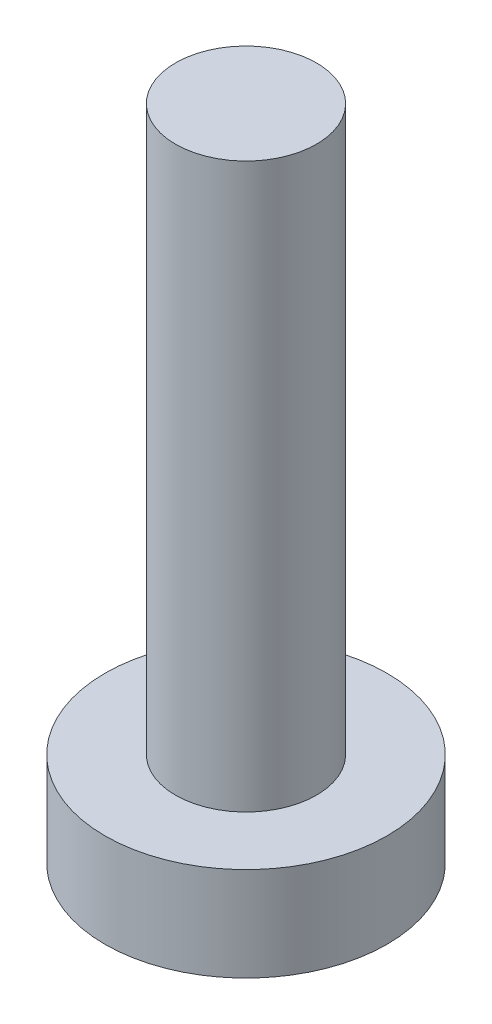
ISO-10303-21;
HEADER;
FILE_DESCRIPTION(('STEP AP214'),'2;1');
FILE_NAME('part.step','',(''),(''),'','','');
FILE_SCHEMA(('AUTOMOTIVE_DESIGN { 1 0 10303 214 1 1 1 1 }'));
ENDSEC;
DATA;
#1=APPLICATION_CONTEXT('core data for automotive mechanical design processes');
#2=APPLICATION_PROTOCOL_DEFINITION('international standard','automotive_design',2000,#1);
#3=PRODUCT_CONTEXT('',#1,'mechanical');
#4=PRODUCT('Part','Part','',(#3));
#5=PRODUCT_RELATED_PRODUCT_CATEGORY('part','',(#4));
#6=PRODUCT_DEFINITION_FORMATION('','',#4);
#7=PRODUCT_DEFINITION_CONTEXT('part definition',#1,'design');
#8=PRODUCT_DEFINITION('design','',#6,#7);
#9=PRODUCT_DEFINITION_SHAPE('','',#8);
#10=(LENGTH_UNIT() NAMED_UNIT(*) SI_UNIT(.MILLI.,.METRE.));
#11=(NAMED_UNIT(*) PLANE_ANGLE_UNIT() SI_UNIT($,.RADIAN.));
#12=(NAMED_UNIT(*) SI_UNIT($,.STERADIAN.) SOLID_ANGLE_UNIT());
#13=UNCERTAINTY_MEASURE_WITH_UNIT(LENGTH_MEASURE(1.E-05),#10,'distance_accuracy_value','');
#14=(GEOMETRIC_REPRESENTATION_CONTEXT(3) GLOBAL_UNCERTAINTY_ASSIGNED_CONTEXT((#13)) GLOBAL_UNIT_ASSIGNED_CONTEXT((#10,
#11,#12)) REPRESENTATION_CONTEXT('',''));
#15=CARTESIAN_POINT('',(0.,0.,0.));
#16=DIRECTION('',(0.,0.,1.));
#17=DIRECTION('',(1.,0.,0.));
#18=AXIS2_PLACEMENT_3D('',#15,#16,#17);
#19=CARTESIAN_POINT('',(0.,2.,0.));
#20=DIRECTION('',(0.,-1.,0.));
#21=DIRECTION('',(0.,0.,-1.));
#22=AXIS2_PLACEMENT_3D('',#19,#20,#21);
#23=CYLINDRICAL_SURFACE('',#22,3.);
#24=CARTESIAN_POINT('',(0.,2.,0.));
#25=DIRECTION('',(0.,1.,0.));
#26=DIRECTION('',(0.,0.,1.));
#27=AXIS2_PLACEMENT_3D('',#24,#25,#26);
#28=CIRCLE('',#27,3.);
#29=CARTESIAN_POINT('',(0.,2.,3.));
#30=VERTEX_POINT('',#29);
#31=EDGE_CURVE('E48',#30,#30,#28,.T.);
#32=ORIENTED_EDGE('',*,*,#31,.F.);
#33=EDGE_LOOP('',(#32));
#34=FACE_BOUND('',#33,.T.);
#35=CARTESIAN_POINT('',(0.,0.,0.));
#36=DIRECTION('',(0.,1.,0.));
#37=DIRECTION('',(0.,0.,1.));
#38=AXIS2_PLACEMENT_3D('',#35,#36,#37);
#39=CIRCLE('',#38,3.);
#40=CARTESIAN_POINT('',(0.,0.,3.));
#41=VERTEX_POINT('',#40);
#42=EDGE_CURVE('E43',#41,#41,#39,.T.);
#43=ORIENTED_EDGE('',*,*,#42,.T.);
#44=EDGE_LOOP('',(#43));
#45=FACE_BOUND('',#44,.T.);
#46=ADVANCED_FACE('F40',(#34,#45),#23,.T.);
#47=CARTESIAN_POINT('',(0.,2.,0.));
#48=DIRECTION('',(0.,1.,0.));
#49=DIRECTION('',(0.,0.,1.));
#50=AXIS2_PLACEMENT_3D('',#47,#48,#49);
#51=PLANE('',#50);
#52=CARTESIAN_POINT('',(0.,2.,0.));
#53=DIRECTION('',(0.,1.,0.));
#54=DIRECTION('',(0.,0.,1.));
#55=AXIS2_PLACEMENT_3D('',#52,#53,#54);
#56=CIRCLE('',#55,1.5);
#57=CARTESIAN_POINT('',(0.,2.,1.5));
#58=VERTEX_POINT('',#57);
#59=EDGE_CURVE('E10',#58,#58,#56,.T.);
#60=ORIENTED_EDGE('',*,*,#59,.F.);
#61=EDGE_LOOP('',(#60));
#62=FACE_BOUND('',#61,.T.);
#63=ORIENTED_EDGE('',*,*,#31,.T.);
#64=EDGE_LOOP('',(#63));
#65=FACE_BOUND('',#64,.T.);
#66=ADVANCED_FACE('F68',(#62,#65),#51,.T.);
#67=CARTESIAN_POINT('',(0.,0.,0.));
#68=DIRECTION('',(0.,1.,0.));
#69=DIRECTION('',(0.,0.,1.));
#70=AXIS2_PLACEMENT_3D('',#67,#68,#69);
#71=PLANE('',#70);
#72=ORIENTED_EDGE('',*,*,#42,.F.);
#73=EDGE_LOOP('',(#72));
#74=FACE_BOUND('',#73,.T.);
#75=ADVANCED_FACE('F65',(#74),#71,.F.);
#76=CARTESIAN_POINT('',(0.,14.,0.));
#77=DIRECTION('',(0.,-1.,0.));
#78=DIRECTION('',(0.,0.,-1.));
#79=AXIS2_PLACEMENT_3D('',#76,#77,#78);
#80=CYLINDRICAL_SURFACE('',#79,1.5);
#81=CARTESIAN_POINT('',(0.,14.,0.));
#82=DIRECTION('',(0.,1.,0.));
#83=DIRECTION('',(0.,0.,1.));
#84=AXIS2_PLACEMENT_3D('',#81,#82,#83);
#85=CIRCLE('',#84,1.5);
#86=CARTESIAN_POINT('',(0.,14.,1.5));
#87=VERTEX_POINT('',#86);
#88=EDGE_CURVE('E55',#87,#87,#85,.T.);
#89=ORIENTED_EDGE('',*,*,#88,.F.);
#90=EDGE_LOOP('',(#89));
#91=FACE_BOUND('',#90,.T.);
#92=ORIENTED_EDGE('',*,*,#59,.T.);
#93=EDGE_LOOP('',(#92));
#94=FACE_BOUND('',#93,.T.);
#95=ADVANCED_FACE('F67',(#91,#94),#80,.T.);
#96=CARTESIAN_POINT('',(0.,14.,0.));
#97=DIRECTION('',(0.,1.,0.));
#98=DIRECTION('',(0.,0.,1.));
#99=AXIS2_PLACEMENT_3D('',#96,#97,#98);
#100=PLANE('',#99);
#101=ORIENTED_EDGE('',*,*,#88,.T.);
#102=EDGE_LOOP('',(#101));
#103=FACE_BOUND('',#102,.T.);
#104=ADVANCED_FACE('F73',(#103),#100,.T.);
#105=CLOSED_SHELL('',(#46,#66,#75,#95,#104));
#106=MANIFOLD_SOLID_BREP('B2',#105);
#107=ADVANCED_BREP_SHAPE_REPRESENTATION('',(#18,#106),#14);
#108=SHAPE_DEFINITION_REPRESENTATION(#9,#107);
ENDSEC;
END-ISO-10303-21;
